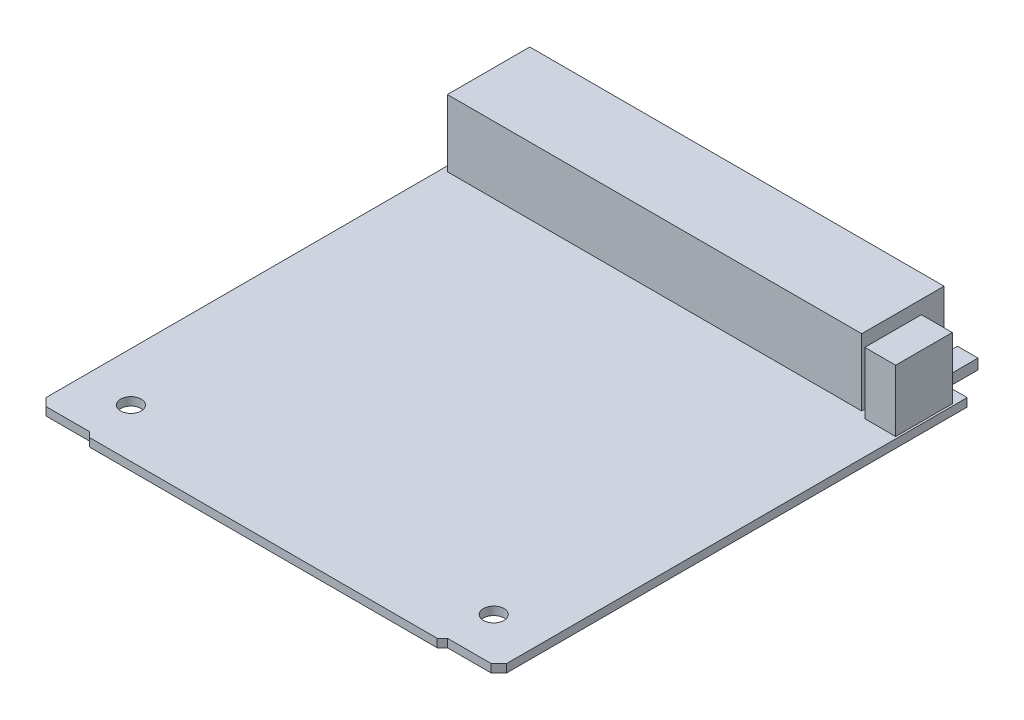
ISO-10303-21;
HEADER;
FILE_DESCRIPTION(('STEP AP214'),'2;1');
FILE_NAME('part.step','',(''),(''),'','','');
FILE_SCHEMA(('AUTOMOTIVE_DESIGN { 1 0 10303 214 1 1 1 1 }'));
ENDSEC;
DATA;
#1=APPLICATION_CONTEXT('core data for automotive mechanical design processes');
#2=APPLICATION_PROTOCOL_DEFINITION('international standard','automotive_design',2000,#1);
#3=PRODUCT_CONTEXT('',#1,'mechanical');
#4=PRODUCT('Part','Part','',(#3));
#5=PRODUCT_RELATED_PRODUCT_CATEGORY('part','',(#4));
#6=PRODUCT_DEFINITION_FORMATION('','',#4);
#7=PRODUCT_DEFINITION_CONTEXT('part definition',#1,'design');
#8=PRODUCT_DEFINITION('design','',#6,#7);
#9=PRODUCT_DEFINITION_SHAPE('','',#8);
#10=(LENGTH_UNIT() NAMED_UNIT(*) SI_UNIT(.MILLI.,.METRE.));
#11=(NAMED_UNIT(*) PLANE_ANGLE_UNIT() SI_UNIT($,.RADIAN.));
#12=(NAMED_UNIT(*) SI_UNIT($,.STERADIAN.) SOLID_ANGLE_UNIT());
#13=UNCERTAINTY_MEASURE_WITH_UNIT(LENGTH_MEASURE(1.E-05),#10,'distance_accuracy_value','');
#14=(GEOMETRIC_REPRESENTATION_CONTEXT(3) GLOBAL_UNCERTAINTY_ASSIGNED_CONTEXT((#13)) GLOBAL_UNIT_ASSIGNED_CONTEXT((#10,
#11,#12)) REPRESENTATION_CONTEXT('',''));
#15=CARTESIAN_POINT('',(0.,0.,0.));
#16=DIRECTION('',(0.,0.,1.));
#17=DIRECTION('',(1.,0.,0.));
#18=AXIS2_PLACEMENT_3D('',#15,#16,#17);
#19=CARTESIAN_POINT('',(38.35,13.6,-43.));
#20=DIRECTION('',(0.,0.,1.));
#21=DIRECTION('',(1.,0.,0.));
#22=AXIS2_PLACEMENT_3D('',#19,#20,#21);
#23=PLANE('',#22);
#24=DIRECTION('',(-1.,0.,0.));
#25=VECTOR('',#24,1.);
#26=CARTESIAN_POINT('',(38.35,1.6,-43.));
#27=LINE('',#26,#25);
#28=CARTESIAN_POINT('',(44.35,1.6,-43.));
#29=VERTEX_POINT('',#28);
#30=CARTESIAN_POINT('',(38.35,1.6,-43.));
#31=VERTEX_POINT('',#30);
#32=EDGE_CURVE('E234',#29,#31,#27,.T.);
#33=ORIENTED_EDGE('',*,*,#32,.T.);
#34=DIRECTION('',(0.,-1.,0.));
#35=VECTOR('',#34,1.);
#36=CARTESIAN_POINT('',(38.35,13.6,-43.));
#37=LINE('',#36,#35);
#38=CARTESIAN_POINT('',(38.35,13.6,-43.));
#39=VERTEX_POINT('',#38);
#40=EDGE_CURVE('E239',#39,#31,#37,.T.);
#41=ORIENTED_EDGE('',*,*,#40,.F.);
#42=DIRECTION('',(-1.,0.,0.));
#43=VECTOR('',#42,1.);
#44=CARTESIAN_POINT('',(38.35,13.6,-43.));
#45=LINE('',#44,#43);
#46=CARTESIAN_POINT('',(44.35,13.6,-43.));
#47=VERTEX_POINT('',#46);
#48=EDGE_CURVE('E238',#47,#39,#45,.T.);
#49=ORIENTED_EDGE('',*,*,#48,.F.);
#50=DIRECTION('',(0.,-1.,0.));
#51=VECTOR('',#50,1.);
#52=CARTESIAN_POINT('',(44.35,13.6,-43.));
#53=LINE('',#52,#51);
#54=EDGE_CURVE('E248',#47,#29,#53,.T.);
#55=ORIENTED_EDGE('',*,*,#54,.T.);
#56=EDGE_LOOP('',(#33,#41,#49,#55));
#57=FACE_BOUND('',#56,.T.);
#58=DIRECTION('',(0.,-1.,0.));
#59=VECTOR('',#58,1.);
#60=CARTESIAN_POINT('',(43.35,5.8,-43.));
#61=LINE('',#60,#59);
#62=CARTESIAN_POINT('',(43.35,5.8,-43.));
#63=VERTEX_POINT('',#62);
#64=CARTESIAN_POINT('',(43.35,3.8,-43.));
#65=VERTEX_POINT('',#64);
#66=EDGE_CURVE('E220',#63,#65,#61,.T.);
#67=ORIENTED_EDGE('',*,*,#66,.F.);
#68=DIRECTION('',(1.,0.,0.));
#69=VECTOR('',#68,1.);
#70=CARTESIAN_POINT('',(43.35,5.8,-43.));
#71=LINE('',#70,#69);
#72=CARTESIAN_POINT('',(39.35,5.8,-43.));
#73=VERTEX_POINT('',#72);
#74=EDGE_CURVE('E217',#73,#63,#71,.T.);
#75=ORIENTED_EDGE('',*,*,#74,.F.);
#76=DIRECTION('',(0.,1.,0.));
#77=VECTOR('',#76,1.);
#78=CARTESIAN_POINT('',(39.35,5.8,-43.));
#79=LINE('',#78,#77);
#80=CARTESIAN_POINT('',(39.35,3.8,-43.));
#81=VERTEX_POINT('',#80);
#82=EDGE_CURVE('E66',#81,#73,#79,.T.);
#83=ORIENTED_EDGE('',*,*,#82,.F.);
#84=DIRECTION('',(-1.,0.,0.));
#85=VECTOR('',#84,1.);
#86=CARTESIAN_POINT('',(43.35,3.8,-43.));
#87=LINE('',#86,#85);
#88=EDGE_CURVE('E61',#65,#81,#87,.T.);
#89=ORIENTED_EDGE('',*,*,#88,.F.);
#90=EDGE_LOOP('',(#67,#75,#83,#89));
#91=FACE_BOUND('',#90,.T.);
#92=ADVANCED_FACE('F45',(#57,#91),#23,.F.);
#93=CARTESIAN_POINT('',(0.,1.6,0.));
#94=DIRECTION('',(0.,1.,0.));
#95=DIRECTION('',(0.,0.,1.));
#96=AXIS2_PLACEMENT_3D('',#93,#94,#95);
#97=PLANE('',#96);
#98=CARTESIAN_POINT('',(-35.25,1.6,37.));
#99=DIRECTION('',(0.,1.,0.));
#100=DIRECTION('',(0.,0.,1.));
#101=AXIS2_PLACEMENT_3D('',#98,#99,#100);
#102=CIRCLE('',#101,2.);
#103=CARTESIAN_POINT('',(-35.25,1.6,39.));
#104=VERTEX_POINT('',#103);
#105=EDGE_CURVE('E256',#104,#104,#102,.T.);
#106=ORIENTED_EDGE('',*,*,#105,.F.);
#107=EDGE_LOOP('',(#106));
#108=FACE_BOUND('',#107,.T.);
#109=CARTESIAN_POINT('',(35.25,1.6,37.));
#110=DIRECTION('',(0.,1.,0.));
#111=DIRECTION('',(0.,0.,1.));
#112=AXIS2_PLACEMENT_3D('',#109,#110,#111);
#113=CIRCLE('',#112,2.);
#114=CARTESIAN_POINT('',(35.25,1.6,39.));
#115=VERTEX_POINT('',#114);
#116=EDGE_CURVE('E260',#115,#115,#113,.T.);
#117=ORIENTED_EDGE('',*,*,#116,.F.);
#118=EDGE_LOOP('',(#117));
#119=FACE_BOUND('',#118,.T.);
#120=DIRECTION('',(1.,0.,0.));
#121=VECTOR('',#120,1.);
#122=CARTESIAN_POINT('',(34.75,1.6,45.5));
#123=LINE('',#122,#121);
#124=CARTESIAN_POINT('',(34.75,1.6,45.5));
#125=VERTEX_POINT('',#124);
#126=CARTESIAN_POINT('',(43.25,1.6,45.5));
#127=VERTEX_POINT('',#126);
#128=EDGE_CURVE('E314',#125,#127,#123,.T.);
#129=ORIENTED_EDGE('',*,*,#128,.T.);
#130=DIRECTION('',(-0.707106781186548,0.,0.707106781186548));
#131=VECTOR('',#130,1.);
#132=CARTESIAN_POINT('',(44.375,1.6,44.375));
#133=LINE('',#132,#131);
#134=CARTESIAN_POINT('',(44.75,1.6,44.));
#135=VERTEX_POINT('',#134);
#136=EDGE_CURVE('E369',#127,#135,#133,.F.);
#137=ORIENTED_EDGE('',*,*,#136,.T.);
#138=DIRECTION('',(0.,0.,-1.));
#139=VECTOR('',#138,1.);
#140=CARTESIAN_POINT('',(44.75,1.6,-45.5));
#141=LINE('',#140,#139);
#142=CARTESIAN_POINT('',(44.75,1.6,-45.5));
#143=VERTEX_POINT('',#142);
#144=EDGE_CURVE('E317',#135,#143,#141,.T.);
#145=ORIENTED_EDGE('',*,*,#144,.T.);
#146=DIRECTION('',(-1.,0.,0.));
#147=VECTOR('',#146,1.);
#148=CARTESIAN_POINT('',(-44.75,1.6,-45.5));
#149=LINE('',#148,#147);
#150=CARTESIAN_POINT('',(36.75,1.6,-45.5));
#151=VERTEX_POINT('',#150);
#152=EDGE_CURVE('E320',#143,#151,#149,.T.);
#153=ORIENTED_EDGE('',*,*,#152,.T.);
#154=DIRECTION('',(0.,0.,-1.));
#155=VECTOR('',#154,1.);
#156=CARTESIAN_POINT('',(36.75,1.6,-33.));
#157=LINE('',#156,#155);
#158=CARTESIAN_POINT('',(36.75,1.6,-33.));
#159=VERTEX_POINT('',#158);
#160=EDGE_CURVE('E286',#159,#151,#157,.T.);
#161=ORIENTED_EDGE('',*,*,#160,.F.);
#162=DIRECTION('',(1.,0.,0.));
#163=VECTOR('',#162,1.);
#164=CARTESIAN_POINT('',(-43.75,1.6,-33.));
#165=LINE('',#164,#163);
#166=CARTESIAN_POINT('',(-43.75,1.6,-33.));
#167=VERTEX_POINT('',#166);
#168=EDGE_CURVE('E281',#167,#159,#165,.T.);
#169=ORIENTED_EDGE('',*,*,#168,.F.);
#170=DIRECTION('',(0.,0.,1.));
#171=VECTOR('',#170,1.);
#172=CARTESIAN_POINT('',(-43.75,1.6,-33.));
#173=LINE('',#172,#171);
#174=CARTESIAN_POINT('',(-43.75,1.6,-45.5));
#175=VERTEX_POINT('',#174);
#176=EDGE_CURVE('E282',#175,#167,#173,.T.);
#177=ORIENTED_EDGE('',*,*,#176,.F.);
#178=CARTESIAN_POINT('',(-44.75,1.6,-45.5));
#179=VERTEX_POINT('',#178);
#180=EDGE_CURVE('E319',#175,#179,#149,.T.);
#181=ORIENTED_EDGE('',*,*,#180,.T.);
#182=DIRECTION('',(0.,0.,1.));
#183=VECTOR('',#182,1.);
#184=CARTESIAN_POINT('',(-44.75,1.6,-45.5));
#185=LINE('',#184,#183);
#186=CARTESIAN_POINT('',(-44.75,1.6,44.));
#187=VERTEX_POINT('',#186);
#188=EDGE_CURVE('E302',#179,#187,#185,.T.);
#189=ORIENTED_EDGE('',*,*,#188,.T.);
#190=DIRECTION('',(-0.707106781186548,0.,-0.707106781186548));
#191=VECTOR('',#190,1.);
#192=CARTESIAN_POINT('',(-44.375,1.6,44.375));
#193=LINE('',#192,#191);
#194=CARTESIAN_POINT('',(-43.25,1.6,45.5));
#195=VERTEX_POINT('',#194);
#196=EDGE_CURVE('E367',#187,#195,#193,.F.);
#197=ORIENTED_EDGE('',*,*,#196,.T.);
#198=DIRECTION('',(1.,0.,0.));
#199=VECTOR('',#198,1.);
#200=CARTESIAN_POINT('',(-44.75,1.6,45.5));
#201=LINE('',#200,#199);
#202=CARTESIAN_POINT('',(-34.75,1.6,45.5));
#203=VERTEX_POINT('',#202);
#204=EDGE_CURVE('E305',#195,#203,#201,.T.);
#205=ORIENTED_EDGE('',*,*,#204,.T.);
#206=DIRECTION('',(0.707106781186547,0.,0.707106781186547));
#207=VECTOR('',#206,1.);
#208=CARTESIAN_POINT('',(-34.75,1.6,45.5));
#209=LINE('',#208,#207);
#210=CARTESIAN_POINT('',(-33.75,1.6,46.5));
#211=VERTEX_POINT('',#210);
#212=EDGE_CURVE('E308',#203,#211,#209,.T.);
#213=ORIENTED_EDGE('',*,*,#212,.T.);
#214=DIRECTION('',(1.,0.,0.));
#215=VECTOR('',#214,1.);
#216=CARTESIAN_POINT('',(-33.75,1.6,46.5));
#217=LINE('',#216,#215);
#218=CARTESIAN_POINT('',(33.75,1.6,46.5));
#219=VERTEX_POINT('',#218);
#220=EDGE_CURVE('E310',#211,#219,#217,.T.);
#221=ORIENTED_EDGE('',*,*,#220,.T.);
#222=DIRECTION('',(0.707106781186547,0.,-0.707106781186547));
#223=VECTOR('',#222,1.);
#224=CARTESIAN_POINT('',(33.75,1.6,46.5));
#225=LINE('',#224,#223);
#226=EDGE_CURVE('E312',#219,#125,#225,.T.);
#227=ORIENTED_EDGE('',*,*,#226,.T.);
#228=EDGE_LOOP('',(#129,#137,#145,#153,#161,#169,#177,#181,#189,#197,#205,#213,#221,#227));
#229=FACE_BOUND('',#228,.T.);
#230=DIRECTION('',(1.,0.,0.));
#231=VECTOR('',#230,1.);
#232=CARTESIAN_POINT('',(38.35,1.6,-32.));
#233=LINE('',#232,#231);
#234=CARTESIAN_POINT('',(38.35,1.6,-32.));
#235=VERTEX_POINT('',#234);
#236=CARTESIAN_POINT('',(44.35,1.6,-32.));
#237=VERTEX_POINT('',#236);
#238=EDGE_CURVE('E224',#235,#237,#233,.T.);
#239=ORIENTED_EDGE('',*,*,#238,.F.);
#240=DIRECTION('',(0.,0.,1.));
#241=VECTOR('',#240,1.);
#242=CARTESIAN_POINT('',(38.35,1.6,-43.));
#243=LINE('',#242,#241);
#244=EDGE_CURVE('E221',#31,#235,#243,.T.);
#245=ORIENTED_EDGE('',*,*,#244,.F.);
#246=ORIENTED_EDGE('',*,*,#32,.F.);
#247=DIRECTION('',(0.,0.,-1.));
#248=VECTOR('',#247,1.);
#249=CARTESIAN_POINT('',(44.35,1.6,-43.));
#250=LINE('',#249,#248);
#251=EDGE_CURVE('E242',#237,#29,#250,.T.);
#252=ORIENTED_EDGE('',*,*,#251,.F.);
#253=EDGE_LOOP('',(#239,#245,#246,#252));
#254=FACE_BOUND('',#253,.T.);
#255=ADVANCED_FACE('F396',(#108,#119,#229,#254),#97,.T.);
#256=CARTESIAN_POINT('',(-44.75,1.6,-45.5));
#257=DIRECTION('',(1.,0.,0.));
#258=DIRECTION('',(0.,0.,-1.));
#259=AXIS2_PLACEMENT_3D('',#256,#257,#258);
#260=PLANE('',#259);
#261=DIRECTION('',(0.,0.,1.));
#262=VECTOR('',#261,1.);
#263=CARTESIAN_POINT('',(-44.75,0.,-45.5));
#264=LINE('',#263,#262);
#265=CARTESIAN_POINT('',(-44.75,0.,-45.5));
#266=VERTEX_POINT('',#265);
#267=CARTESIAN_POINT('',(-44.75,0.,44.));
#268=VERTEX_POINT('',#267);
#269=EDGE_CURVE('E301',#266,#268,#264,.T.);
#270=ORIENTED_EDGE('',*,*,#269,.T.);
#271=DIRECTION('',(0.,1.,0.));
#272=VECTOR('',#271,1.);
#273=CARTESIAN_POINT('',(-44.75,1.6,44.));
#274=LINE('',#273,#272);
#275=EDGE_CURVE('E11',#268,#187,#274,.T.);
#276=ORIENTED_EDGE('',*,*,#275,.T.);
#277=ORIENTED_EDGE('',*,*,#188,.F.);
#278=DIRECTION('',(0.,-1.,0.));
#279=VECTOR('',#278,1.);
#280=CARTESIAN_POINT('',(-44.75,1.6,-45.5));
#281=LINE('',#280,#279);
#282=EDGE_CURVE('E323',#179,#266,#281,.T.);
#283=ORIENTED_EDGE('',*,*,#282,.T.);
#284=EDGE_LOOP('',(#270,#276,#277,#283));
#285=FACE_BOUND('',#284,.T.);
#286=ADVANCED_FACE('F402',(#285),#260,.F.);
#287=CARTESIAN_POINT('',(-44.75,1.6,45.5));
#288=DIRECTION('',(0.,0.,-1.));
#289=DIRECTION('',(-1.,0.,0.));
#290=AXIS2_PLACEMENT_3D('',#287,#288,#289);
#291=PLANE('',#290);
#292=ORIENTED_EDGE('',*,*,#204,.F.);
#293=DIRECTION('',(0.,-1.,0.));
#294=VECTOR('',#293,1.);
#295=CARTESIAN_POINT('',(-43.25,1.6,45.5));
#296=LINE('',#295,#294);
#297=CARTESIAN_POINT('',(-43.25,0.,45.5));
#298=VERTEX_POINT('',#297);
#299=EDGE_CURVE('E54',#195,#298,#296,.T.);
#300=ORIENTED_EDGE('',*,*,#299,.T.);
#301=DIRECTION('',(1.,0.,0.));
#302=VECTOR('',#301,1.);
#303=CARTESIAN_POINT('',(-44.75,0.,45.5));
#304=LINE('',#303,#302);
#305=CARTESIAN_POINT('',(-34.75,0.,45.5));
#306=VERTEX_POINT('',#305);
#307=EDGE_CURVE('E327',#298,#306,#304,.T.);
#308=ORIENTED_EDGE('',*,*,#307,.T.);
#309=DIRECTION('',(0.,-1.,0.));
#310=VECTOR('',#309,1.);
#311=CARTESIAN_POINT('',(-34.75,1.6,45.5));
#312=LINE('',#311,#310);
#313=EDGE_CURVE('E355',#203,#306,#312,.T.);
#314=ORIENTED_EDGE('',*,*,#313,.F.);
#315=EDGE_LOOP('',(#292,#300,#308,#314));
#316=FACE_BOUND('',#315,.T.);
#317=ADVANCED_FACE('F375',(#316),#291,.F.);
#318=CARTESIAN_POINT('',(-34.75,1.6,45.5));
#319=DIRECTION('',(0.707106781186548,0.,-0.707106781186548));
#320=DIRECTION('',(-0.707106781186548,0.,-0.707106781186548));
#321=AXIS2_PLACEMENT_3D('',#318,#319,#320);
#322=PLANE('',#321);
#323=DIRECTION('',(0.707106781186547,0.,0.707106781186547));
#324=VECTOR('',#323,1.);
#325=CARTESIAN_POINT('',(-34.75,0.,45.5));
#326=LINE('',#325,#324);
#327=CARTESIAN_POINT('',(-33.75,0.,46.5));
#328=VERTEX_POINT('',#327);
#329=EDGE_CURVE('E329',#306,#328,#326,.T.);
#330=ORIENTED_EDGE('',*,*,#329,.T.);
#331=DIRECTION('',(0.,-1.,0.));
#332=VECTOR('',#331,1.);
#333=CARTESIAN_POINT('',(-33.75,1.6,46.5));
#334=LINE('',#333,#332);
#335=EDGE_CURVE('E352',#211,#328,#334,.T.);
#336=ORIENTED_EDGE('',*,*,#335,.F.);
#337=ORIENTED_EDGE('',*,*,#212,.F.);
#338=ORIENTED_EDGE('',*,*,#313,.T.);
#339=EDGE_LOOP('',(#330,#336,#337,#338));
#340=FACE_BOUND('',#339,.T.);
#341=ADVANCED_FACE('F388',(#340),#322,.F.);
#342=CARTESIAN_POINT('',(-33.75,1.6,46.5));
#343=DIRECTION('',(0.,0.,-1.));
#344=DIRECTION('',(-1.,0.,0.));
#345=AXIS2_PLACEMENT_3D('',#342,#343,#344);
#346=PLANE('',#345);
#347=DIRECTION('',(1.,0.,0.));
#348=VECTOR('',#347,1.);
#349=CARTESIAN_POINT('',(-33.75,0.,46.5));
#350=LINE('',#349,#348);
#351=CARTESIAN_POINT('',(33.75,0.,46.5));
#352=VERTEX_POINT('',#351);
#353=EDGE_CURVE('E331',#328,#352,#350,.T.);
#354=ORIENTED_EDGE('',*,*,#353,.T.);
#355=DIRECTION('',(0.,-1.,0.));
#356=VECTOR('',#355,1.);
#357=CARTESIAN_POINT('',(33.75,1.6,46.5));
#358=LINE('',#357,#356);
#359=EDGE_CURVE('E349',#219,#352,#358,.T.);
#360=ORIENTED_EDGE('',*,*,#359,.F.);
#361=ORIENTED_EDGE('',*,*,#220,.F.);
#362=ORIENTED_EDGE('',*,*,#335,.T.);
#363=EDGE_LOOP('',(#354,#360,#361,#362));
#364=FACE_BOUND('',#363,.T.);
#365=ADVANCED_FACE('F392',(#364),#346,.F.);
#366=CARTESIAN_POINT('',(33.75,1.6,46.5));
#367=DIRECTION('',(-0.707106781186548,0.,-0.707106781186548));
#368=DIRECTION('',(-0.707106781186548,0.,0.707106781186548));
#369=AXIS2_PLACEMENT_3D('',#366,#367,#368);
#370=PLANE('',#369);
#371=DIRECTION('',(0.707106781186547,0.,-0.707106781186547));
#372=VECTOR('',#371,1.);
#373=CARTESIAN_POINT('',(33.75,0.,46.5));
#374=LINE('',#373,#372);
#375=CARTESIAN_POINT('',(34.75,0.,45.5));
#376=VERTEX_POINT('',#375);
#377=EDGE_CURVE('E333',#352,#376,#374,.T.);
#378=ORIENTED_EDGE('',*,*,#377,.T.);
#379=DIRECTION('',(0.,-1.,0.));
#380=VECTOR('',#379,1.);
#381=CARTESIAN_POINT('',(34.75,1.6,45.5));
#382=LINE('',#381,#380);
#383=EDGE_CURVE('E346',#125,#376,#382,.T.);
#384=ORIENTED_EDGE('',*,*,#383,.F.);
#385=ORIENTED_EDGE('',*,*,#226,.F.);
#386=ORIENTED_EDGE('',*,*,#359,.T.);
#387=EDGE_LOOP('',(#378,#384,#385,#386));
#388=FACE_BOUND('',#387,.T.);
#389=ADVANCED_FACE('F423',(#388),#370,.F.);
#390=CARTESIAN_POINT('',(34.75,1.6,45.5));
#391=DIRECTION('',(0.,0.,-1.));
#392=DIRECTION('',(-1.,0.,0.));
#393=AXIS2_PLACEMENT_3D('',#390,#391,#392);
#394=PLANE('',#393);
#395=DIRECTION('',(1.,0.,0.));
#396=VECTOR('',#395,1.);
#397=CARTESIAN_POINT('',(34.75,0.,45.5));
#398=LINE('',#397,#396);
#399=CARTESIAN_POINT('',(43.25,0.,45.5));
#400=VERTEX_POINT('',#399);
#401=EDGE_CURVE('E335',#376,#400,#398,.T.);
#402=ORIENTED_EDGE('',*,*,#401,.T.);
#403=DIRECTION('',(0.,1.,0.));
#404=VECTOR('',#403,1.);
#405=CARTESIAN_POINT('',(43.25,1.6,45.5));
#406=LINE('',#405,#404);
#407=EDGE_CURVE('E365',#400,#127,#406,.T.);
#408=ORIENTED_EDGE('',*,*,#407,.T.);
#409=ORIENTED_EDGE('',*,*,#128,.F.);
#410=ORIENTED_EDGE('',*,*,#383,.T.);
#411=EDGE_LOOP('',(#402,#408,#409,#410));
#412=FACE_BOUND('',#411,.T.);
#413=ADVANCED_FACE('F420',(#412),#394,.F.);
#414=CARTESIAN_POINT('',(44.75,1.6,-45.5));
#415=DIRECTION('',(-1.,0.,0.));
#416=DIRECTION('',(0.,0.,1.));
#417=AXIS2_PLACEMENT_3D('',#414,#415,#416);
#418=PLANE('',#417);
#419=ORIENTED_EDGE('',*,*,#144,.F.);
#420=DIRECTION('',(0.,-1.,0.));
#421=VECTOR('',#420,1.);
#422=CARTESIAN_POINT('',(44.75,1.6,44.));
#423=LINE('',#422,#421);
#424=CARTESIAN_POINT('',(44.75,0.,44.));
#425=VERTEX_POINT('',#424);
#426=EDGE_CURVE('E358',#135,#425,#423,.T.);
#427=ORIENTED_EDGE('',*,*,#426,.T.);
#428=DIRECTION('',(0.,0.,-1.));
#429=VECTOR('',#428,1.);
#430=CARTESIAN_POINT('',(44.75,0.,-45.5));
#431=LINE('',#430,#429);
#432=CARTESIAN_POINT('',(44.75,0.,-45.5));
#433=VERTEX_POINT('',#432);
#434=EDGE_CURVE('E338',#425,#433,#431,.T.);
#435=ORIENTED_EDGE('',*,*,#434,.T.);
#436=DIRECTION('',(0.,-1.,0.));
#437=VECTOR('',#436,1.);
#438=CARTESIAN_POINT('',(44.75,1.6,-45.5));
#439=LINE('',#438,#437);
#440=EDGE_CURVE('E343',#143,#433,#439,.T.);
#441=ORIENTED_EDGE('',*,*,#440,.F.);
#442=EDGE_LOOP('',(#419,#427,#435,#441));
#443=FACE_BOUND('',#442,.T.);
#444=ADVANCED_FACE('F412',(#443),#418,.F.);
#445=CARTESIAN_POINT('',(-44.75,1.6,-45.5));
#446=DIRECTION('',(0.,0.,1.));
#447=DIRECTION('',(1.,0.,0.));
#448=AXIS2_PLACEMENT_3D('',#445,#446,#447);
#449=PLANE('',#448);
#450=DIRECTION('',(-1.,0.,0.));
#451=VECTOR('',#450,1.);
#452=CARTESIAN_POINT('',(-44.75,0.,-45.5));
#453=LINE('',#452,#451);
#454=EDGE_CURVE('E306',#433,#266,#453,.T.);
#455=ORIENTED_EDGE('',*,*,#454,.T.);
#456=ORIENTED_EDGE('',*,*,#282,.F.);
#457=ORIENTED_EDGE('',*,*,#180,.F.);
#458=EDGE_CURVE('E324',#151,#175,#149,.T.);
#459=ORIENTED_EDGE('',*,*,#458,.F.);
#460=ORIENTED_EDGE('',*,*,#152,.F.);
#461=ORIENTED_EDGE('',*,*,#440,.T.);
#462=EDGE_LOOP('',(#455,#456,#457,#459,#460,#461));
#463=FACE_BOUND('',#462,.T.);
#464=ADVANCED_FACE('F406',(#463),#449,.F.);
#465=CARTESIAN_POINT('',(0.,0.,0.));
#466=DIRECTION('',(0.,1.,0.));
#467=DIRECTION('',(0.,0.,1.));
#468=AXIS2_PLACEMENT_3D('',#465,#466,#467);
#469=PLANE('',#468);
#470=CARTESIAN_POINT('',(-35.25,0.,37.));
#471=DIRECTION('',(0.,1.,0.));
#472=DIRECTION('',(0.,0.,1.));
#473=AXIS2_PLACEMENT_3D('',#470,#471,#472);
#474=CIRCLE('',#473,2.);
#475=CARTESIAN_POINT('',(-35.25,0.,39.));
#476=VERTEX_POINT('',#475);
#477=EDGE_CURVE('E259',#476,#476,#474,.F.);
#478=ORIENTED_EDGE('',*,*,#477,.F.);
#479=EDGE_LOOP('',(#478));
#480=FACE_BOUND('',#479,.T.);
#481=CARTESIAN_POINT('',(35.25,0.,37.));
#482=DIRECTION('',(0.,1.,0.));
#483=DIRECTION('',(0.,0.,1.));
#484=AXIS2_PLACEMENT_3D('',#481,#482,#483);
#485=CIRCLE('',#484,2.);
#486=CARTESIAN_POINT('',(35.25,0.,39.));
#487=VERTEX_POINT('',#486);
#488=EDGE_CURVE('E255',#487,#487,#485,.F.);
#489=ORIENTED_EDGE('',*,*,#488,.F.);
#490=EDGE_LOOP('',(#489));
#491=FACE_BOUND('',#490,.T.);
#492=ORIENTED_EDGE('',*,*,#434,.F.);
#493=DIRECTION('',(0.707106781186548,0.,-0.707106781186548));
#494=VECTOR('',#493,1.);
#495=CARTESIAN_POINT('',(44.75,0.,44.));
#496=LINE('',#495,#494);
#497=EDGE_CURVE('E363',#425,#400,#496,.F.);
#498=ORIENTED_EDGE('',*,*,#497,.T.);
#499=ORIENTED_EDGE('',*,*,#401,.F.);
#500=ORIENTED_EDGE('',*,*,#377,.F.);
#501=ORIENTED_EDGE('',*,*,#353,.F.);
#502=ORIENTED_EDGE('',*,*,#329,.F.);
#503=ORIENTED_EDGE('',*,*,#307,.F.);
#504=DIRECTION('',(0.707106781186548,0.,0.707106781186548));
#505=VECTOR('',#504,1.);
#506=CARTESIAN_POINT('',(-43.25,0.,45.5));
#507=LINE('',#506,#505);
#508=EDGE_CURVE('E361',#298,#268,#507,.F.);
#509=ORIENTED_EDGE('',*,*,#508,.T.);
#510=ORIENTED_EDGE('',*,*,#269,.F.);
#511=ORIENTED_EDGE('',*,*,#454,.F.);
#512=EDGE_LOOP('',(#492,#498,#499,#500,#501,#502,#503,#509,#510,#511));
#513=FACE_BOUND('',#512,.T.);
#514=ADVANCED_FACE('F382',(#480,#491,#513),#469,.F.);
#515=CARTESIAN_POINT('',(-43.75,14.6,-33.));
#516=DIRECTION('',(1.,0.,0.));
#517=DIRECTION('',(0.,0.,-1.));
#518=AXIS2_PLACEMENT_3D('',#515,#516,#517);
#519=PLANE('',#518);
#520=CARTESIAN_POINT('',(-43.75,1.6,-49.));
#521=VERTEX_POINT('',#520);
#522=EDGE_CURVE('E263',#521,#175,#173,.T.);
#523=ORIENTED_EDGE('',*,*,#522,.T.);
#524=ORIENTED_EDGE('',*,*,#176,.T.);
#525=DIRECTION('',(0.,-1.,0.));
#526=VECTOR('',#525,1.);
#527=CARTESIAN_POINT('',(-43.75,14.6,-33.));
#528=LINE('',#527,#526);
#529=CARTESIAN_POINT('',(-43.75,14.6,-33.));
#530=VERTEX_POINT('',#529);
#531=EDGE_CURVE('E298',#530,#167,#528,.T.);
#532=ORIENTED_EDGE('',*,*,#531,.F.);
#533=DIRECTION('',(0.,0.,1.));
#534=VECTOR('',#533,1.);
#535=CARTESIAN_POINT('',(-43.75,14.6,-33.));
#536=LINE('',#535,#534);
#537=CARTESIAN_POINT('',(-43.75,14.6,-49.));
#538=VERTEX_POINT('',#537);
#539=EDGE_CURVE('E268',#538,#530,#536,.T.);
#540=ORIENTED_EDGE('',*,*,#539,.F.);
#541=DIRECTION('',(0.,-1.,0.));
#542=VECTOR('',#541,1.);
#543=CARTESIAN_POINT('',(-43.75,14.6,-49.));
#544=LINE('',#543,#542);
#545=EDGE_CURVE('E278',#538,#521,#544,.T.);
#546=ORIENTED_EDGE('',*,*,#545,.T.);
#547=EDGE_LOOP('',(#523,#524,#532,#540,#546));
#548=FACE_BOUND('',#547,.T.);
#549=ADVANCED_FACE('F484',(#548),#519,.F.);
#550=CARTESIAN_POINT('',(-43.75,14.6,-33.));
#551=DIRECTION('',(0.,0.,-1.));
#552=DIRECTION('',(-1.,0.,0.));
#553=AXIS2_PLACEMENT_3D('',#550,#551,#552);
#554=PLANE('',#553);
#555=ORIENTED_EDGE('',*,*,#168,.T.);
#556=DIRECTION('',(0.,-1.,0.));
#557=VECTOR('',#556,1.);
#558=CARTESIAN_POINT('',(36.75,14.6,-33.));
#559=LINE('',#558,#557);
#560=CARTESIAN_POINT('',(36.75,14.6,-33.));
#561=VERTEX_POINT('',#560);
#562=EDGE_CURVE('E295',#561,#159,#559,.T.);
#563=ORIENTED_EDGE('',*,*,#562,.F.);
#564=DIRECTION('',(1.,0.,0.));
#565=VECTOR('',#564,1.);
#566=CARTESIAN_POINT('',(-43.75,14.6,-33.));
#567=LINE('',#566,#565);
#568=EDGE_CURVE('E271',#530,#561,#567,.T.);
#569=ORIENTED_EDGE('',*,*,#568,.F.);
#570=ORIENTED_EDGE('',*,*,#531,.T.);
#571=EDGE_LOOP('',(#555,#563,#569,#570));
#572=FACE_BOUND('',#571,.T.);
#573=ADVANCED_FACE('F480',(#572),#554,.F.);
#574=CARTESIAN_POINT('',(36.75,14.6,-33.));
#575=DIRECTION('',(-1.,0.,0.));
#576=DIRECTION('',(0.,0.,1.));
#577=AXIS2_PLACEMENT_3D('',#574,#575,#576);
#578=PLANE('',#577);
#579=ORIENTED_EDGE('',*,*,#160,.T.);
#580=CARTESIAN_POINT('',(36.75,1.6,-49.));
#581=VERTEX_POINT('',#580);
#582=EDGE_CURVE('E285',#151,#581,#157,.T.);
#583=ORIENTED_EDGE('',*,*,#582,.T.);
#584=DIRECTION('',(0.,-1.,0.));
#585=VECTOR('',#584,1.);
#586=CARTESIAN_POINT('',(36.75,14.6,-49.));
#587=LINE('',#586,#585);
#588=CARTESIAN_POINT('',(36.75,14.6,-49.));
#589=VERTEX_POINT('',#588);
#590=EDGE_CURVE('E292',#589,#581,#587,.T.);
#591=ORIENTED_EDGE('',*,*,#590,.F.);
#592=DIRECTION('',(0.,0.,-1.));
#593=VECTOR('',#592,1.);
#594=CARTESIAN_POINT('',(36.75,14.6,-33.));
#595=LINE('',#594,#593);
#596=EDGE_CURVE('E274',#561,#589,#595,.T.);
#597=ORIENTED_EDGE('',*,*,#596,.F.);
#598=ORIENTED_EDGE('',*,*,#562,.T.);
#599=EDGE_LOOP('',(#579,#583,#591,#597,#598));
#600=FACE_BOUND('',#599,.T.);
#601=ADVANCED_FACE('F476',(#600),#578,.F.);
#602=CARTESIAN_POINT('',(-43.75,14.6,-49.));
#603=DIRECTION('',(0.,0.,1.));
#604=DIRECTION('',(1.,0.,0.));
#605=AXIS2_PLACEMENT_3D('',#602,#603,#604);
#606=PLANE('',#605);
#607=DIRECTION('',(-1.,0.,0.));
#608=VECTOR('',#607,1.);
#609=CARTESIAN_POINT('',(-43.75,1.6,-49.));
#610=LINE('',#609,#608);
#611=EDGE_CURVE('E272',#581,#521,#610,.T.);
#612=ORIENTED_EDGE('',*,*,#611,.T.);
#613=ORIENTED_EDGE('',*,*,#545,.F.);
#614=DIRECTION('',(-1.,0.,0.));
#615=VECTOR('',#614,1.);
#616=CARTESIAN_POINT('',(-43.75,14.6,-49.));
#617=LINE('',#616,#615);
#618=EDGE_CURVE('E276',#589,#538,#617,.T.);
#619=ORIENTED_EDGE('',*,*,#618,.F.);
#620=ORIENTED_EDGE('',*,*,#590,.T.);
#621=EDGE_LOOP('',(#612,#613,#619,#620));
#622=FACE_BOUND('',#621,.T.);
#623=ADVANCED_FACE('F469',(#622),#606,.F.);
#624=CARTESIAN_POINT('',(0.,14.6,0.));
#625=DIRECTION('',(0.,-1.,0.));
#626=DIRECTION('',(0.,0.,-1.));
#627=AXIS2_PLACEMENT_3D('',#624,#625,#626);
#628=PLANE('',#627);
#629=ORIENTED_EDGE('',*,*,#539,.T.);
#630=ORIENTED_EDGE('',*,*,#568,.T.);
#631=ORIENTED_EDGE('',*,*,#596,.T.);
#632=ORIENTED_EDGE('',*,*,#618,.T.);
#633=EDGE_LOOP('',(#629,#630,#631,#632));
#634=FACE_BOUND('',#633,.T.);
#635=ADVANCED_FACE('F466',(#634),#628,.F.);
#636=CARTESIAN_POINT('',(0.,1.6,0.));
#637=DIRECTION('',(0.,-1.,0.));
#638=DIRECTION('',(0.,0.,-1.));
#639=AXIS2_PLACEMENT_3D('',#636,#637,#638);
#640=PLANE('',#639);
#641=ORIENTED_EDGE('',*,*,#582,.F.);
#642=ORIENTED_EDGE('',*,*,#458,.T.);
#643=ORIENTED_EDGE('',*,*,#522,.F.);
#644=ORIENTED_EDGE('',*,*,#611,.F.);
#645=EDGE_LOOP('',(#641,#642,#643,#644));
#646=FACE_BOUND('',#645,.T.);
#647=ADVANCED_FACE('F464',(#646),#640,.T.);
#648=CARTESIAN_POINT('',(35.25,-0.000999999999999916,37.));
#649=DIRECTION('',(0.,1.,0.));
#650=DIRECTION('',(0.,0.,1.));
#651=AXIS2_PLACEMENT_3D('',#648,#649,#650);
#652=CYLINDRICAL_SURFACE('',#651,2.);
#653=ORIENTED_EDGE('',*,*,#116,.T.);
#654=EDGE_LOOP('',(#653));
#655=FACE_BOUND('',#654,.T.);
#656=ORIENTED_EDGE('',*,*,#488,.T.);
#657=EDGE_LOOP('',(#656));
#658=FACE_BOUND('',#657,.T.);
#659=ADVANCED_FACE('F460',(#655,#658),#652,.F.);
#660=CARTESIAN_POINT('',(-35.25,-0.000999999999999916,37.));
#661=DIRECTION('',(0.,1.,0.));
#662=DIRECTION('',(0.,0.,1.));
#663=AXIS2_PLACEMENT_3D('',#660,#661,#662);
#664=CYLINDRICAL_SURFACE('',#663,2.);
#665=ORIENTED_EDGE('',*,*,#105,.T.);
#666=EDGE_LOOP('',(#665));
#667=FACE_BOUND('',#666,.T.);
#668=ORIENTED_EDGE('',*,*,#477,.T.);
#669=EDGE_LOOP('',(#668));
#670=FACE_BOUND('',#669,.T.);
#671=ADVANCED_FACE('F457',(#667,#670),#664,.F.);
#672=CARTESIAN_POINT('',(44.75,1.6,44.));
#673=DIRECTION('',(-0.707106781186548,0.,-0.707106781186548));
#674=DIRECTION('',(0.,-1.,0.));
#675=AXIS2_PLACEMENT_3D('',#672,#673,#674);
#676=PLANE('',#675);
#677=ORIENTED_EDGE('',*,*,#136,.F.);
#678=ORIENTED_EDGE('',*,*,#407,.F.);
#679=ORIENTED_EDGE('',*,*,#497,.F.);
#680=ORIENTED_EDGE('',*,*,#426,.F.);
#681=EDGE_LOOP('',(#677,#678,#679,#680));
#682=FACE_BOUND('',#681,.T.);
#683=ADVANCED_FACE('F416',(#682),#676,.F.);
#684=CARTESIAN_POINT('',(-43.25,1.6,45.5));
#685=DIRECTION('',(0.707106781186548,0.,-0.707106781186548));
#686=DIRECTION('',(0.,-1.,0.));
#687=AXIS2_PLACEMENT_3D('',#684,#685,#686);
#688=PLANE('',#687);
#689=ORIENTED_EDGE('',*,*,#196,.F.);
#690=ORIENTED_EDGE('',*,*,#275,.F.);
#691=ORIENTED_EDGE('',*,*,#508,.F.);
#692=ORIENTED_EDGE('',*,*,#299,.F.);
#693=EDGE_LOOP('',(#689,#690,#691,#692));
#694=FACE_BOUND('',#693,.T.);
#695=ADVANCED_FACE('F48',(#694),#688,.F.);
#696=CARTESIAN_POINT('',(38.35,13.6,-43.));
#697=DIRECTION('',(1.,0.,0.));
#698=DIRECTION('',(0.,0.,-1.));
#699=AXIS2_PLACEMENT_3D('',#696,#697,#698);
#700=PLANE('',#699);
#701=ORIENTED_EDGE('',*,*,#244,.T.);
#702=DIRECTION('',(0.,-1.,0.));
#703=VECTOR('',#702,1.);
#704=CARTESIAN_POINT('',(38.35,13.6,-32.));
#705=LINE('',#704,#703);
#706=CARTESIAN_POINT('',(38.35,13.6,-32.));
#707=VERTEX_POINT('',#706);
#708=EDGE_CURVE('E253',#707,#235,#705,.T.);
#709=ORIENTED_EDGE('',*,*,#708,.F.);
#710=DIRECTION('',(0.,0.,1.));
#711=VECTOR('',#710,1.);
#712=CARTESIAN_POINT('',(38.35,13.6,-43.));
#713=LINE('',#712,#711);
#714=EDGE_CURVE('E230',#39,#707,#713,.T.);
#715=ORIENTED_EDGE('',*,*,#714,.F.);
#716=ORIENTED_EDGE('',*,*,#40,.T.);
#717=EDGE_LOOP('',(#701,#709,#715,#716));
#718=FACE_BOUND('',#717,.T.);
#719=ADVANCED_FACE('F453',(#718),#700,.F.);
#720=CARTESIAN_POINT('',(38.35,13.6,-32.));
#721=DIRECTION('',(0.,0.,-1.));
#722=DIRECTION('',(-1.,0.,0.));
#723=AXIS2_PLACEMENT_3D('',#720,#721,#722);
#724=PLANE('',#723);
#725=ORIENTED_EDGE('',*,*,#238,.T.);
#726=DIRECTION('',(0.,-1.,0.));
#727=VECTOR('',#726,1.);
#728=CARTESIAN_POINT('',(44.35,13.6,-32.));
#729=LINE('',#728,#727);
#730=CARTESIAN_POINT('',(44.35,13.6,-32.));
#731=VERTEX_POINT('',#730);
#732=EDGE_CURVE('E250',#731,#237,#729,.T.);
#733=ORIENTED_EDGE('',*,*,#732,.F.);
#734=DIRECTION('',(1.,0.,0.));
#735=VECTOR('',#734,1.);
#736=CARTESIAN_POINT('',(38.35,13.6,-32.));
#737=LINE('',#736,#735);
#738=EDGE_CURVE('E233',#707,#731,#737,.T.);
#739=ORIENTED_EDGE('',*,*,#738,.F.);
#740=ORIENTED_EDGE('',*,*,#708,.T.);
#741=EDGE_LOOP('',(#725,#733,#739,#740));
#742=FACE_BOUND('',#741,.T.);
#743=ADVANCED_FACE('F449',(#742),#724,.F.);
#744=CARTESIAN_POINT('',(44.35,13.6,-43.));
#745=DIRECTION('',(-1.,0.,0.));
#746=DIRECTION('',(0.,0.,1.));
#747=AXIS2_PLACEMENT_3D('',#744,#745,#746);
#748=PLANE('',#747);
#749=ORIENTED_EDGE('',*,*,#251,.T.);
#750=ORIENTED_EDGE('',*,*,#54,.F.);
#751=DIRECTION('',(0.,0.,-1.));
#752=VECTOR('',#751,1.);
#753=CARTESIAN_POINT('',(44.35,13.6,-43.));
#754=LINE('',#753,#752);
#755=EDGE_CURVE('E236',#731,#47,#754,.T.);
#756=ORIENTED_EDGE('',*,*,#755,.F.);
#757=ORIENTED_EDGE('',*,*,#732,.T.);
#758=EDGE_LOOP('',(#749,#750,#756,#757));
#759=FACE_BOUND('',#758,.T.);
#760=ADVANCED_FACE('F446',(#759),#748,.F.);
#761=CARTESIAN_POINT('',(0.,13.6,0.));
#762=DIRECTION('',(0.,1.,0.));
#763=DIRECTION('',(0.,0.,1.));
#764=AXIS2_PLACEMENT_3D('',#761,#762,#763);
#765=PLANE('',#764);
#766=ORIENTED_EDGE('',*,*,#714,.T.);
#767=ORIENTED_EDGE('',*,*,#738,.T.);
#768=ORIENTED_EDGE('',*,*,#755,.T.);
#769=ORIENTED_EDGE('',*,*,#48,.T.);
#770=EDGE_LOOP('',(#766,#767,#768,#769));
#771=FACE_BOUND('',#770,.T.);
#772=ADVANCED_FACE('F444',(#771),#765,.T.);
#773=CARTESIAN_POINT('',(43.35,5.8,-49.));
#774=DIRECTION('',(-1.,0.,0.));
#775=DIRECTION('',(0.,-1.,0.));
#776=AXIS2_PLACEMENT_3D('',#773,#774,#775);
#777=PLANE('',#776);
#778=ORIENTED_EDGE('',*,*,#66,.T.);
#779=DIRECTION('',(0.,0.,1.));
#780=VECTOR('',#779,1.);
#781=CARTESIAN_POINT('',(43.35,3.8,-49.));
#782=LINE('',#781,#780);
#783=CARTESIAN_POINT('',(43.35,3.8,-49.));
#784=VERTEX_POINT('',#783);
#785=EDGE_CURVE('E201',#784,#65,#782,.T.);
#786=ORIENTED_EDGE('',*,*,#785,.F.);
#787=DIRECTION('',(0.,-1.,0.));
#788=VECTOR('',#787,1.);
#789=CARTESIAN_POINT('',(43.35,5.8,-49.));
#790=LINE('',#789,#788);
#791=CARTESIAN_POINT('',(43.35,5.8,-49.));
#792=VERTEX_POINT('',#791);
#793=EDGE_CURVE('E208',#792,#784,#790,.T.);
#794=ORIENTED_EDGE('',*,*,#793,.F.);
#795=DIRECTION('',(0.,0.,1.));
#796=VECTOR('',#795,1.);
#797=CARTESIAN_POINT('',(43.35,5.8,-49.));
#798=LINE('',#797,#796);
#799=EDGE_CURVE('E804',#792,#63,#798,.T.);
#800=ORIENTED_EDGE('',*,*,#799,.T.);
#801=EDGE_LOOP('',(#778,#786,#794,#800));
#802=FACE_BOUND('',#801,.T.);
#803=ADVANCED_FACE('F219',(#802),#777,.F.);
#804=CARTESIAN_POINT('',(43.35,3.8,-49.));
#805=DIRECTION('',(0.,1.,0.));
#806=DIRECTION('',(0.,0.,1.));
#807=AXIS2_PLACEMENT_3D('',#804,#805,#806);
#808=PLANE('',#807);
#809=ORIENTED_EDGE('',*,*,#88,.T.);
#810=DIRECTION('',(0.,0.,1.));
#811=VECTOR('',#810,1.);
#812=CARTESIAN_POINT('',(39.35,3.8,-49.));
#813=LINE('',#812,#811);
#814=CARTESIAN_POINT('',(39.35,3.8,-49.));
#815=VERTEX_POINT('',#814);
#816=EDGE_CURVE('E204',#815,#81,#813,.T.);
#817=ORIENTED_EDGE('',*,*,#816,.F.);
#818=DIRECTION('',(-1.,0.,0.));
#819=VECTOR('',#818,1.);
#820=CARTESIAN_POINT('',(43.35,3.8,-49.));
#821=LINE('',#820,#819);
#822=EDGE_CURVE('E197',#784,#815,#821,.T.);
#823=ORIENTED_EDGE('',*,*,#822,.F.);
#824=ORIENTED_EDGE('',*,*,#785,.T.);
#825=EDGE_LOOP('',(#809,#817,#823,#824));
#826=FACE_BOUND('',#825,.T.);
#827=ADVANCED_FACE('F199',(#826),#808,.F.);
#828=CARTESIAN_POINT('',(39.35,5.8,-49.));
#829=DIRECTION('',(1.,0.,0.));
#830=DIRECTION('',(0.,0.,-1.));
#831=AXIS2_PLACEMENT_3D('',#828,#829,#830);
#832=PLANE('',#831);
#833=ORIENTED_EDGE('',*,*,#82,.T.);
#834=DIRECTION('',(0.,0.,1.));
#835=VECTOR('',#834,1.);
#836=CARTESIAN_POINT('',(39.35,5.8,-49.));
#837=LINE('',#836,#835);
#838=CARTESIAN_POINT('',(39.35,5.8,-49.));
#839=VERTEX_POINT('',#838);
#840=EDGE_CURVE('E226',#839,#73,#837,.T.);
#841=ORIENTED_EDGE('',*,*,#840,.F.);
#842=DIRECTION('',(0.,1.,0.));
#843=VECTOR('',#842,1.);
#844=CARTESIAN_POINT('',(39.35,5.8,-49.));
#845=LINE('',#844,#843);
#846=EDGE_CURVE('E207',#815,#839,#845,.T.);
#847=ORIENTED_EDGE('',*,*,#846,.F.);
#848=ORIENTED_EDGE('',*,*,#816,.T.);
#849=EDGE_LOOP('',(#833,#841,#847,#848));
#850=FACE_BOUND('',#849,.T.);
#851=ADVANCED_FACE('F583',(#850),#832,.F.);
#852=CARTESIAN_POINT('',(43.35,5.8,-49.));
#853=DIRECTION('',(0.,-1.,0.));
#854=DIRECTION('',(1.,0.,0.));
#855=AXIS2_PLACEMENT_3D('',#852,#853,#854);
#856=PLANE('',#855);
#857=ORIENTED_EDGE('',*,*,#74,.T.);
#858=ORIENTED_EDGE('',*,*,#799,.F.);
#859=DIRECTION('',(1.,0.,0.));
#860=VECTOR('',#859,1.);
#861=CARTESIAN_POINT('',(43.35,5.8,-49.));
#862=LINE('',#861,#860);
#863=EDGE_CURVE('E213',#839,#792,#862,.T.);
#864=ORIENTED_EDGE('',*,*,#863,.F.);
#865=ORIENTED_EDGE('',*,*,#840,.T.);
#866=EDGE_LOOP('',(#857,#858,#864,#865));
#867=FACE_BOUND('',#866,.T.);
#868=ADVANCED_FACE('F592',(#867),#856,.F.);
#869=CARTESIAN_POINT('',(0.,0.,-49.));
#870=DIRECTION('',(0.,0.,-1.));
#871=DIRECTION('',(-1.,0.,0.));
#872=AXIS2_PLACEMENT_3D('',#869,#870,#871);
#873=PLANE('',#872);
#874=ORIENTED_EDGE('',*,*,#793,.T.);
#875=ORIENTED_EDGE('',*,*,#822,.T.);
#876=ORIENTED_EDGE('',*,*,#846,.T.);
#877=ORIENTED_EDGE('',*,*,#863,.T.);
#878=EDGE_LOOP('',(#874,#875,#876,#877));
#879=FACE_BOUND('',#878,.T.);
#880=ADVANCED_FACE('F211',(#879),#873,.T.);
#881=CLOSED_SHELL('',(#92,#255,#286,#317,#341,#365,#389,#413,#444,#464,#514,#549,#573,#601,#623,
#635,#647,#659,#671,#683,#695,#719,#743,#760,#772,#803,#827,#851,#868,#880));
#882=MANIFOLD_SOLID_BREP('B2',#881);
#883=ADVANCED_BREP_SHAPE_REPRESENTATION('',(#18,#882),#14);
#884=SHAPE_DEFINITION_REPRESENTATION(#9,#883);
ENDSEC;
END-ISO-10303-21;
